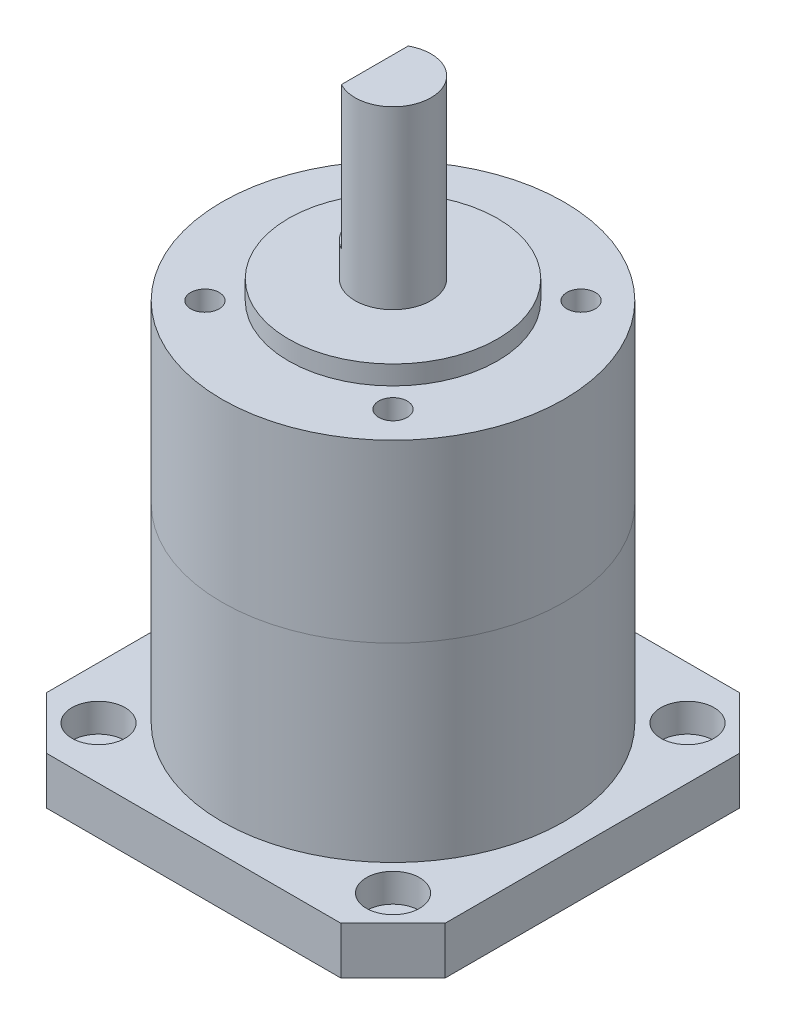
ISO-10303-21;
HEADER;
FILE_DESCRIPTION(('STEP AP214'),'2;1');
FILE_NAME('part.step','',(''),(''),'','','');
FILE_SCHEMA(('AUTOMOTIVE_DESIGN { 1 0 10303 214 1 1 1 1 }'));
ENDSEC;
DATA;
#1=APPLICATION_CONTEXT('core data for automotive mechanical design processes');
#2=APPLICATION_PROTOCOL_DEFINITION('international standard','automotive_design',2000,#1);
#3=PRODUCT_CONTEXT('',#1,'mechanical');
#4=PRODUCT('Part','Part','',(#3));
#5=PRODUCT_RELATED_PRODUCT_CATEGORY('part','',(#4));
#6=PRODUCT_DEFINITION_FORMATION('','',#4);
#7=PRODUCT_DEFINITION_CONTEXT('part definition',#1,'design');
#8=PRODUCT_DEFINITION('design','',#6,#7);
#9=PRODUCT_DEFINITION_SHAPE('','',#8);
#10=(LENGTH_UNIT() NAMED_UNIT(*) SI_UNIT(.MILLI.,.METRE.));
#11=(NAMED_UNIT(*) PLANE_ANGLE_UNIT() SI_UNIT($,.RADIAN.));
#12=(NAMED_UNIT(*) SI_UNIT($,.STERADIAN.) SOLID_ANGLE_UNIT());
#13=UNCERTAINTY_MEASURE_WITH_UNIT(LENGTH_MEASURE(1.E-05),#10,'distance_accuracy_value','');
#14=(GEOMETRIC_REPRESENTATION_CONTEXT(3) GLOBAL_UNCERTAINTY_ASSIGNED_CONTEXT((#13)) GLOBAL_UNIT_ASSIGNED_CONTEXT((#10,
#11,#12)) REPRESENTATION_CONTEXT('',''));
#15=CARTESIAN_POINT('',(0.,0.,0.));
#16=DIRECTION('',(0.,0.,1.));
#17=DIRECTION('',(1.,0.,0.));
#18=AXIS2_PLACEMENT_3D('',#15,#16,#17);
#19=CARTESIAN_POINT('',(-15.5000000000001,9.24264068712275,15.5));
#20=DIRECTION('',(0.,-1.,0.));
#21=DIRECTION('',(0.,0.,-1.));
#22=AXIS2_PLACEMENT_3D('',#19,#20,#21);
#23=CYLINDRICAL_SURFACE('',#22,1.5);
#24=CARTESIAN_POINT('',(-15.5000000000001,0.,15.5));
#25=DIRECTION('',(0.,-1.,0.));
#26=DIRECTION('',(0.,0.,-1.));
#27=AXIS2_PLACEMENT_3D('',#24,#25,#26);
#28=CIRCLE('',#27,1.5);
#29=CARTESIAN_POINT('',(-15.5000000000001,0.,14.));
#30=VERTEX_POINT('',#29);
#31=EDGE_CURVE('E227',#30,#30,#28,.T.);
#32=ORIENTED_EDGE('',*,*,#31,.T.);
#33=EDGE_LOOP('',(#32));
#34=FACE_BOUND('',#33,.T.);
#35=CARTESIAN_POINT('',(-15.5000000000001,2.,15.5));
#36=DIRECTION('',(0.,1.,0.));
#37=DIRECTION('',(0.,0.,1.));
#38=AXIS2_PLACEMENT_3D('',#35,#36,#37);
#39=CIRCLE('',#38,1.5);
#40=CARTESIAN_POINT('',(-15.5000000000001,2.,17.));
#41=VERTEX_POINT('',#40);
#42=EDGE_CURVE('E49',#41,#41,#39,.F.);
#43=ORIENTED_EDGE('',*,*,#42,.F.);
#44=EDGE_LOOP('',(#43));
#45=FACE_BOUND('',#44,.T.);
#46=ADVANCED_FACE('F44',(#34,#45),#23,.F.);
#47=CARTESIAN_POINT('',(15.5,9.24264068712275,15.5000000000009));
#48=DIRECTION('',(0.,-1.,0.));
#49=DIRECTION('',(0.,0.,-1.));
#50=AXIS2_PLACEMENT_3D('',#47,#48,#49);
#51=CYLINDRICAL_SURFACE('',#50,1.5000000000009);
#52=CARTESIAN_POINT('',(15.5,0.,15.5000000000009));
#53=DIRECTION('',(0.,-1.,0.));
#54=DIRECTION('',(0.,0.,-1.));
#55=AXIS2_PLACEMENT_3D('',#52,#53,#54);
#56=CIRCLE('',#55,1.5000000000009);
#57=CARTESIAN_POINT('',(15.5,0.,14.));
#58=VERTEX_POINT('',#57);
#59=EDGE_CURVE('E223',#58,#58,#56,.T.);
#60=ORIENTED_EDGE('',*,*,#59,.T.);
#61=EDGE_LOOP('',(#60));
#62=FACE_BOUND('',#61,.T.);
#63=CARTESIAN_POINT('',(15.5,2.,15.5000000000009));
#64=DIRECTION('',(0.,1.,0.));
#65=DIRECTION('',(0.,0.,1.));
#66=AXIS2_PLACEMENT_3D('',#63,#64,#65);
#67=CIRCLE('',#66,1.5000000000009);
#68=CARTESIAN_POINT('',(15.5,2.,17.0000000000018));
#69=VERTEX_POINT('',#68);
#70=EDGE_CURVE('E326',#69,#69,#67,.F.);
#71=ORIENTED_EDGE('',*,*,#70,.F.);
#72=EDGE_LOOP('',(#71));
#73=FACE_BOUND('',#72,.T.);
#74=ADVANCED_FACE('F338',(#62,#73),#51,.F.);
#75=CARTESIAN_POINT('',(15.5000000000009,9.24264068712275,-15.4999999999991));
#76=DIRECTION('',(0.,-1.,0.));
#77=DIRECTION('',(0.,0.,-1.));
#78=AXIS2_PLACEMENT_3D('',#75,#76,#77);
#79=CYLINDRICAL_SURFACE('',#78,1.50000000000123);
#80=CARTESIAN_POINT('',(15.5000000000009,0.,-15.4999999999991));
#81=DIRECTION('',(0.,-1.,0.));
#82=DIRECTION('',(0.,0.,-1.));
#83=AXIS2_PLACEMENT_3D('',#80,#81,#82);
#84=CIRCLE('',#83,1.50000000000123);
#85=CARTESIAN_POINT('',(15.5000000000009,0.,-17.0000000000004));
#86=VERTEX_POINT('',#85);
#87=EDGE_CURVE('E228',#86,#86,#84,.T.);
#88=ORIENTED_EDGE('',*,*,#87,.T.);
#89=EDGE_LOOP('',(#88));
#90=FACE_BOUND('',#89,.T.);
#91=CARTESIAN_POINT('',(15.5000000000009,2.,-15.4999999999991));
#92=DIRECTION('',(0.,1.,0.));
#93=DIRECTION('',(0.,0.,1.));
#94=AXIS2_PLACEMENT_3D('',#91,#92,#93);
#95=CIRCLE('',#94,1.50000000000123);
#96=CARTESIAN_POINT('',(15.5000000000009,2.,-13.9999999999979));
#97=VERTEX_POINT('',#96);
#98=EDGE_CURVE('E322',#97,#97,#95,.F.);
#99=ORIENTED_EDGE('',*,*,#98,.F.);
#100=EDGE_LOOP('',(#99));
#101=FACE_BOUND('',#100,.T.);
#102=ADVANCED_FACE('F344',(#90,#101),#79,.F.);
#103=CARTESIAN_POINT('',(-15.4999999999991,9.24264068712275,-15.5000000000001));
#104=DIRECTION('',(0.,-1.,0.));
#105=DIRECTION('',(0.,0.,-1.));
#106=AXIS2_PLACEMENT_3D('',#103,#104,#105);
#107=CYLINDRICAL_SURFACE('',#106,1.50000000000047);
#108=CARTESIAN_POINT('',(-15.4999999999991,0.,-15.5000000000001));
#109=DIRECTION('',(0.,-1.,0.));
#110=DIRECTION('',(0.,0.,-1.));
#111=AXIS2_PLACEMENT_3D('',#108,#109,#110);
#112=CIRCLE('',#111,1.50000000000047);
#113=CARTESIAN_POINT('',(-15.4999999999991,0.,-17.0000000000005));
#114=VERTEX_POINT('',#113);
#115=EDGE_CURVE('E219',#114,#114,#112,.T.);
#116=ORIENTED_EDGE('',*,*,#115,.T.);
#117=EDGE_LOOP('',(#116));
#118=FACE_BOUND('',#117,.T.);
#119=CARTESIAN_POINT('',(-15.4999999999991,2.,-15.5000000000001));
#120=DIRECTION('',(0.,1.,0.));
#121=DIRECTION('',(0.,0.,1.));
#122=AXIS2_PLACEMENT_3D('',#119,#120,#121);
#123=CIRCLE('',#122,1.50000000000047);
#124=CARTESIAN_POINT('',(-15.4999999999991,2.,-13.9999999999996));
#125=VERTEX_POINT('',#124);
#126=EDGE_CURVE('E318',#125,#125,#123,.F.);
#127=ORIENTED_EDGE('',*,*,#126,.F.);
#128=EDGE_LOOP('',(#127));
#129=FACE_BOUND('',#128,.T.);
#130=ADVANCED_FACE('F349',(#118,#129),#107,.F.);
#131=CARTESIAN_POINT('',(0.,64.,0.));
#132=DIRECTION('',(0.,-1.,0.));
#133=DIRECTION('',(0.,0.,-1.));
#134=AXIS2_PLACEMENT_3D('',#131,#132,#133);
#135=CYLINDRICAL_SURFACE('',#134,4.);
#136=CARTESIAN_POINT('',(0.,45.5,0.));
#137=DIRECTION('',(0.,1.,0.));
#138=DIRECTION('',(0.,0.,1.));
#139=AXIS2_PLACEMENT_3D('',#136,#137,#138);
#140=CIRCLE('',#139,4.);
#141=CARTESIAN_POINT('',(0.,45.5,4.));
#142=VERTEX_POINT('',#141);
#143=EDGE_CURVE('E55',#142,#142,#140,.T.);
#144=ORIENTED_EDGE('',*,*,#143,.T.);
#145=EDGE_LOOP('',(#144));
#146=FACE_BOUND('',#145,.T.);
#147=DIRECTION('',(0.,1.,0.));
#148=VECTOR('',#147,1.);
#149=CARTESIAN_POINT('',(-1.91418574428097,49.,-3.51224898553498));
#150=LINE('',#149,#148);
#151=CARTESIAN_POINT('',(-1.91418574428097,49.,-3.51224898553498));
#152=VERTEX_POINT('',#151);
#153=CARTESIAN_POINT('',(-1.91418574428097,64.,-3.51224898553498));
#154=VERTEX_POINT('',#153);
#155=EDGE_CURVE('E125',#152,#154,#150,.T.);
#156=ORIENTED_EDGE('',*,*,#155,.T.);
#157=CARTESIAN_POINT('',(0.,64.,0.));
#158=DIRECTION('',(0.,1.,0.));
#159=DIRECTION('',(0.,0.,1.));
#160=AXIS2_PLACEMENT_3D('',#157,#158,#159);
#161=CIRCLE('',#160,4.);
#162=CARTESIAN_POINT('',(-1.91418574428097,64.,3.51224898553498));
#163=VERTEX_POINT('',#162);
#164=EDGE_CURVE('E164',#163,#154,#161,.T.);
#165=ORIENTED_EDGE('',*,*,#164,.F.);
#166=DIRECTION('',(0.,1.,0.));
#167=VECTOR('',#166,1.);
#168=CARTESIAN_POINT('',(-1.91418574428097,49.,3.51224898553498));
#169=LINE('',#168,#167);
#170=CARTESIAN_POINT('',(-1.91418574428097,49.,3.51224898553498));
#171=VERTEX_POINT('',#170);
#172=EDGE_CURVE('E63',#171,#163,#169,.T.);
#173=ORIENTED_EDGE('',*,*,#172,.F.);
#174=CARTESIAN_POINT('',(0.,49.,0.));
#175=DIRECTION('',(0.,1.,0.));
#176=DIRECTION('',(0.,0.,1.));
#177=AXIS2_PLACEMENT_3D('',#174,#175,#176);
#178=CIRCLE('',#177,4.);
#179=EDGE_CURVE('E136',#152,#171,#178,.T.);
#180=ORIENTED_EDGE('',*,*,#179,.F.);
#181=EDGE_LOOP('',(#156,#165,#173,#180));
#182=FACE_BOUND('',#181,.T.);
#183=ADVANCED_FACE('F142',(#146,#182),#135,.T.);
#184=CARTESIAN_POINT('',(0.,64.,0.));
#185=DIRECTION('',(0.,1.,0.));
#186=DIRECTION('',(0.,0.,1.));
#187=AXIS2_PLACEMENT_3D('',#184,#185,#186);
#188=PLANE('',#187);
#189=ORIENTED_EDGE('',*,*,#164,.T.);
#190=DIRECTION('',(0.,0.,1.));
#191=VECTOR('',#190,1.);
#192=CARTESIAN_POINT('',(-1.91418574428097,64.,0.));
#193=LINE('',#192,#191);
#194=EDGE_CURVE('E130',#154,#163,#193,.T.);
#195=ORIENTED_EDGE('',*,*,#194,.T.);
#196=EDGE_LOOP('',(#189,#195));
#197=FACE_BOUND('',#196,.T.);
#198=ADVANCED_FACE('F434',(#197),#188,.T.);
#199=CARTESIAN_POINT('',(0.,43.5,0.));
#200=DIRECTION('',(0.,-1.,0.));
#201=DIRECTION('',(0.,0.,-1.));
#202=AXIS2_PLACEMENT_3D('',#199,#200,#201);
#203=CYLINDRICAL_SURFACE('',#202,18.);
#204=CARTESIAN_POINT('',(0.,43.5,0.));
#205=DIRECTION('',(0.,1.,0.));
#206=DIRECTION('',(0.,0.,1.));
#207=AXIS2_PLACEMENT_3D('',#204,#205,#206);
#208=CIRCLE('',#207,18.);
#209=CARTESIAN_POINT('',(0.,43.5,18.));
#210=VERTEX_POINT('',#209);
#211=EDGE_CURVE('E215',#210,#210,#208,.T.);
#212=ORIENTED_EDGE('',*,*,#211,.F.);
#213=EDGE_LOOP('',(#212));
#214=FACE_BOUND('',#213,.T.);
#215=CARTESIAN_POINT('',(0.,25.,0.));
#216=DIRECTION('',(0.,1.,0.));
#217=DIRECTION('',(0.,0.,1.));
#218=AXIS2_PLACEMENT_3D('',#215,#216,#217);
#219=CIRCLE('',#218,18.);
#220=CARTESIAN_POINT('',(0.,25.,18.));
#221=VERTEX_POINT('',#220);
#222=EDGE_CURVE('E12',#221,#221,#219,.T.);
#223=ORIENTED_EDGE('',*,*,#222,.T.);
#224=EDGE_LOOP('',(#223));
#225=FACE_BOUND('',#224,.T.);
#226=ADVANCED_FACE('F374',(#214,#225),#203,.T.);
#227=CARTESIAN_POINT('',(21.,5.,-21.));
#228=DIRECTION('',(-1.,0.,0.));
#229=DIRECTION('',(0.,0.,1.));
#230=AXIS2_PLACEMENT_3D('',#227,#228,#229);
#231=PLANE('',#230);
#232=DIRECTION('',(0.,0.,-1.));
#233=VECTOR('',#232,1.);
#234=CARTESIAN_POINT('',(21.,5.,-21.));
#235=LINE('',#234,#233);
#236=CARTESIAN_POINT('',(21.,5.,15.5));
#237=VERTEX_POINT('',#236);
#238=CARTESIAN_POINT('',(21.,5.,-15.5));
#239=VERTEX_POINT('',#238);
#240=EDGE_CURVE('E239',#237,#239,#235,.T.);
#241=ORIENTED_EDGE('',*,*,#240,.F.);
#242=DIRECTION('',(0.,-1.,0.));
#243=VECTOR('',#242,1.);
#244=CARTESIAN_POINT('',(21.,5.,15.5));
#245=LINE('',#244,#243);
#246=CARTESIAN_POINT('',(21.,0.,15.5));
#247=VERTEX_POINT('',#246);
#248=EDGE_CURVE('E309',#237,#247,#245,.T.);
#249=ORIENTED_EDGE('',*,*,#248,.T.);
#250=DIRECTION('',(0.,0.,-1.));
#251=VECTOR('',#250,1.);
#252=CARTESIAN_POINT('',(21.,0.,-21.));
#253=LINE('',#252,#251);
#254=CARTESIAN_POINT('',(21.,0.,-15.5));
#255=VERTEX_POINT('',#254);
#256=EDGE_CURVE('E238',#247,#255,#253,.T.);
#257=ORIENTED_EDGE('',*,*,#256,.T.);
#258=DIRECTION('',(0.,1.,0.));
#259=VECTOR('',#258,1.);
#260=CARTESIAN_POINT('',(21.,5.,-15.5));
#261=LINE('',#260,#259);
#262=EDGE_CURVE('E306',#255,#239,#261,.T.);
#263=ORIENTED_EDGE('',*,*,#262,.T.);
#264=EDGE_LOOP('',(#241,#249,#257,#263));
#265=FACE_BOUND('',#264,.T.);
#266=ADVANCED_FACE('F371',(#265),#231,.F.);
#267=CARTESIAN_POINT('',(-21.,5.,-21.));
#268=DIRECTION('',(0.,0.,1.));
#269=DIRECTION('',(1.,0.,0.));
#270=AXIS2_PLACEMENT_3D('',#267,#268,#269);
#271=PLANE('',#270);
#272=DIRECTION('',(-1.,0.,0.));
#273=VECTOR('',#272,1.);
#274=CARTESIAN_POINT('',(-21.,5.,-21.));
#275=LINE('',#274,#273);
#276=CARTESIAN_POINT('',(15.5,5.,-21.));
#277=VERTEX_POINT('',#276);
#278=CARTESIAN_POINT('',(-15.5,5.,-21.));
#279=VERTEX_POINT('',#278);
#280=EDGE_CURVE('E243',#277,#279,#275,.T.);
#281=ORIENTED_EDGE('',*,*,#280,.F.);
#282=DIRECTION('',(0.,-1.,0.));
#283=VECTOR('',#282,1.);
#284=CARTESIAN_POINT('',(15.5,5.,-21.));
#285=LINE('',#284,#283);
#286=CARTESIAN_POINT('',(15.5,0.,-21.));
#287=VERTEX_POINT('',#286);
#288=EDGE_CURVE('E174',#277,#287,#285,.T.);
#289=ORIENTED_EDGE('',*,*,#288,.T.);
#290=DIRECTION('',(-1.,0.,0.));
#291=VECTOR('',#290,1.);
#292=CARTESIAN_POINT('',(-21.,0.,-21.));
#293=LINE('',#292,#291);
#294=CARTESIAN_POINT('',(-15.5,0.,-21.));
#295=VERTEX_POINT('',#294);
#296=EDGE_CURVE('E259',#287,#295,#293,.T.);
#297=ORIENTED_EDGE('',*,*,#296,.T.);
#298=DIRECTION('',(0.,1.,0.));
#299=VECTOR('',#298,1.);
#300=CARTESIAN_POINT('',(-15.5,5.,-21.));
#301=LINE('',#300,#299);
#302=EDGE_CURVE('E71',#295,#279,#301,.T.);
#303=ORIENTED_EDGE('',*,*,#302,.T.);
#304=EDGE_LOOP('',(#281,#289,#297,#303));
#305=FACE_BOUND('',#304,.T.);
#306=ADVANCED_FACE('F367',(#305),#271,.F.);
#307=CARTESIAN_POINT('',(-21.,5.,-21.));
#308=DIRECTION('',(1.,0.,0.));
#309=DIRECTION('',(0.,0.,-1.));
#310=AXIS2_PLACEMENT_3D('',#307,#308,#309);
#311=PLANE('',#310);
#312=DIRECTION('',(0.,0.,1.));
#313=VECTOR('',#312,1.);
#314=CARTESIAN_POINT('',(-21.,0.,-21.));
#315=LINE('',#314,#313);
#316=CARTESIAN_POINT('',(-21.,0.,-15.5));
#317=VERTEX_POINT('',#316);
#318=CARTESIAN_POINT('',(-21.,0.,15.5));
#319=VERTEX_POINT('',#318);
#320=EDGE_CURVE('E262',#317,#319,#315,.T.);
#321=ORIENTED_EDGE('',*,*,#320,.T.);
#322=DIRECTION('',(0.,1.,0.));
#323=VECTOR('',#322,1.);
#324=CARTESIAN_POINT('',(-21.,5.,15.5));
#325=LINE('',#324,#323);
#326=CARTESIAN_POINT('',(-21.,5.,15.5));
#327=VERTEX_POINT('',#326);
#328=EDGE_CURVE('E291',#319,#327,#325,.T.);
#329=ORIENTED_EDGE('',*,*,#328,.T.);
#330=DIRECTION('',(0.,0.,1.));
#331=VECTOR('',#330,1.);
#332=CARTESIAN_POINT('',(-21.,5.,-21.));
#333=LINE('',#332,#331);
#334=CARTESIAN_POINT('',(-21.,5.,-15.5));
#335=VERTEX_POINT('',#334);
#336=EDGE_CURVE('E247',#335,#327,#333,.T.);
#337=ORIENTED_EDGE('',*,*,#336,.F.);
#338=DIRECTION('',(0.,-1.,0.));
#339=VECTOR('',#338,1.);
#340=CARTESIAN_POINT('',(-21.,5.,-15.5));
#341=LINE('',#340,#339);
#342=EDGE_CURVE('E287',#335,#317,#341,.T.);
#343=ORIENTED_EDGE('',*,*,#342,.T.);
#344=EDGE_LOOP('',(#321,#329,#337,#343));
#345=FACE_BOUND('',#344,.T.);
#346=ADVANCED_FACE('F363',(#345),#311,.F.);
#347=CARTESIAN_POINT('',(-21.,5.,21.));
#348=DIRECTION('',(0.,0.,-1.));
#349=DIRECTION('',(-1.,0.,0.));
#350=AXIS2_PLACEMENT_3D('',#347,#348,#349);
#351=PLANE('',#350);
#352=DIRECTION('',(1.,0.,0.));
#353=VECTOR('',#352,1.);
#354=CARTESIAN_POINT('',(-21.,5.,21.));
#355=LINE('',#354,#353);
#356=CARTESIAN_POINT('',(-15.5,5.,21.));
#357=VERTEX_POINT('',#356);
#358=CARTESIAN_POINT('',(15.5,5.,21.));
#359=VERTEX_POINT('',#358);
#360=EDGE_CURVE('E251',#357,#359,#355,.T.);
#361=ORIENTED_EDGE('',*,*,#360,.F.);
#362=DIRECTION('',(0.,-1.,0.));
#363=VECTOR('',#362,1.);
#364=CARTESIAN_POINT('',(-15.5,5.,21.));
#365=LINE('',#364,#363);
#366=CARTESIAN_POINT('',(-15.5,0.,21.));
#367=VERTEX_POINT('',#366);
#368=EDGE_CURVE('E271',#357,#367,#365,.T.);
#369=ORIENTED_EDGE('',*,*,#368,.T.);
#370=DIRECTION('',(1.,0.,0.));
#371=VECTOR('',#370,1.);
#372=CARTESIAN_POINT('',(-21.,0.,21.));
#373=LINE('',#372,#371);
#374=CARTESIAN_POINT('',(15.5,0.,21.));
#375=VERTEX_POINT('',#374);
#376=EDGE_CURVE('E244',#367,#375,#373,.T.);
#377=ORIENTED_EDGE('',*,*,#376,.T.);
#378=DIRECTION('',(0.,1.,0.));
#379=VECTOR('',#378,1.);
#380=CARTESIAN_POINT('',(15.5,5.,21.));
#381=LINE('',#380,#379);
#382=EDGE_CURVE('E255',#375,#359,#381,.T.);
#383=ORIENTED_EDGE('',*,*,#382,.T.);
#384=EDGE_LOOP('',(#361,#369,#377,#383));
#385=FACE_BOUND('',#384,.T.);
#386=ADVANCED_FACE('F355',(#385),#351,.F.);
#387=CARTESIAN_POINT('',(0.,5.,0.));
#388=DIRECTION('',(0.,1.,0.));
#389=DIRECTION('',(0.,0.,1.));
#390=AXIS2_PLACEMENT_3D('',#387,#388,#389);
#391=PLANE('',#390);
#392=CARTESIAN_POINT('',(15.5000000000009,5.,-15.4999999999991));
#393=DIRECTION('',(0.,1.,0.));
#394=DIRECTION('',(0.,0.,1.));
#395=AXIS2_PLACEMENT_3D('',#392,#393,#394);
#396=CIRCLE('',#395,2.8);
#397=CARTESIAN_POINT('',(15.5000000000009,5.,-12.6999999999991));
#398=VERTEX_POINT('',#397);
#399=EDGE_CURVE('E836',#398,#398,#396,.T.);
#400=ORIENTED_EDGE('',*,*,#399,.F.);
#401=EDGE_LOOP('',(#400));
#402=FACE_BOUND('',#401,.T.);
#403=CARTESIAN_POINT('',(-15.5000000000001,5.,15.5));
#404=DIRECTION('',(0.,1.,0.));
#405=DIRECTION('',(0.,0.,1.));
#406=AXIS2_PLACEMENT_3D('',#403,#404,#405);
#407=CIRCLE('',#406,2.8);
#408=CARTESIAN_POINT('',(-15.5000000000001,5.,18.3));
#409=VERTEX_POINT('',#408);
#410=EDGE_CURVE('E829',#409,#409,#407,.T.);
#411=ORIENTED_EDGE('',*,*,#410,.F.);
#412=EDGE_LOOP('',(#411));
#413=FACE_BOUND('',#412,.T.);
#414=CARTESIAN_POINT('',(15.5,5.,15.5000000000009));
#415=DIRECTION('',(0.,1.,0.));
#416=DIRECTION('',(0.,0.,1.));
#417=AXIS2_PLACEMENT_3D('',#414,#415,#416);
#418=CIRCLE('',#417,2.8);
#419=CARTESIAN_POINT('',(15.5,5.,18.3000000000009));
#420=VERTEX_POINT('',#419);
#421=EDGE_CURVE('E839',#420,#420,#418,.T.);
#422=ORIENTED_EDGE('',*,*,#421,.F.);
#423=EDGE_LOOP('',(#422));
#424=FACE_BOUND('',#423,.T.);
#425=CARTESIAN_POINT('',(-15.4999999999991,5.,-15.5000000000001));
#426=DIRECTION('',(0.,1.,0.));
#427=DIRECTION('',(0.,0.,1.));
#428=AXIS2_PLACEMENT_3D('',#425,#426,#427);
#429=CIRCLE('',#428,2.8);
#430=CARTESIAN_POINT('',(-15.4999999999991,5.,-12.7000000000001));
#431=VERTEX_POINT('',#430);
#432=EDGE_CURVE('E845',#431,#431,#429,.T.);
#433=ORIENTED_EDGE('',*,*,#432,.F.);
#434=EDGE_LOOP('',(#433));
#435=FACE_BOUND('',#434,.T.);
#436=CARTESIAN_POINT('',(0.,5.,0.));
#437=DIRECTION('',(0.,1.,0.));
#438=DIRECTION('',(0.,0.,1.));
#439=AXIS2_PLACEMENT_3D('',#436,#437,#438);
#440=CIRCLE('',#439,18.);
#441=CARTESIAN_POINT('',(0.,5.,18.));
#442=VERTEX_POINT('',#441);
#443=EDGE_CURVE('E211',#442,#442,#440,.T.);
#444=ORIENTED_EDGE('',*,*,#443,.F.);
#445=EDGE_LOOP('',(#444));
#446=FACE_BOUND('',#445,.T.);
#447=ORIENTED_EDGE('',*,*,#336,.T.);
#448=DIRECTION('',(-0.707106781186547,0.,-0.707106781186548));
#449=VECTOR('',#448,1.);
#450=CARTESIAN_POINT('',(-18.25,5.,18.25));
#451=LINE('',#450,#449);
#452=EDGE_CURVE('E303',#327,#357,#451,.F.);
#453=ORIENTED_EDGE('',*,*,#452,.T.);
#454=ORIENTED_EDGE('',*,*,#360,.T.);
#455=DIRECTION('',(-0.707106781186548,0.,0.707106781186547));
#456=VECTOR('',#455,1.);
#457=CARTESIAN_POINT('',(18.25,5.,18.25));
#458=LINE('',#457,#456);
#459=EDGE_CURVE('E300',#359,#237,#458,.F.);
#460=ORIENTED_EDGE('',*,*,#459,.T.);
#461=ORIENTED_EDGE('',*,*,#240,.T.);
#462=DIRECTION('',(0.707106781186548,0.,0.707106781186547));
#463=VECTOR('',#462,1.);
#464=CARTESIAN_POINT('',(18.25,5.,-18.25));
#465=LINE('',#464,#463);
#466=EDGE_CURVE('E297',#239,#277,#465,.F.);
#467=ORIENTED_EDGE('',*,*,#466,.T.);
#468=ORIENTED_EDGE('',*,*,#280,.T.);
#469=DIRECTION('',(0.707106781186548,0.,-0.707106781186548));
#470=VECTOR('',#469,1.);
#471=CARTESIAN_POINT('',(-18.25,5.,-18.25));
#472=LINE('',#471,#470);
#473=EDGE_CURVE('E294',#279,#335,#472,.F.);
#474=ORIENTED_EDGE('',*,*,#473,.T.);
#475=EDGE_LOOP('',(#447,#453,#454,#460,#461,#467,#468,#474));
#476=FACE_BOUND('',#475,.T.);
#477=ADVANCED_FACE('F351',(#402,#413,#424,#435,#446,#476),#391,.T.);
#478=CARTESIAN_POINT('',(0.,0.,0.));
#479=DIRECTION('',(0.,1.,0.));
#480=DIRECTION('',(0.,0.,1.));
#481=AXIS2_PLACEMENT_3D('',#478,#479,#480);
#482=PLANE('',#481);
#483=CARTESIAN_POINT('',(0.,0.,0.));
#484=DIRECTION('',(0.,-1.,0.));
#485=DIRECTION('',(0.,0.,-1.));
#486=AXIS2_PLACEMENT_3D('',#483,#484,#485);
#487=CIRCLE('',#486,11.);
#488=CARTESIAN_POINT('',(0.,0.,-11.));
#489=VERTEX_POINT('',#488);
#490=EDGE_CURVE('E156',#489,#489,#487,.T.);
#491=ORIENTED_EDGE('',*,*,#490,.F.);
#492=EDGE_LOOP('',(#491));
#493=FACE_BOUND('',#492,.T.);
#494=ORIENTED_EDGE('',*,*,#115,.F.);
#495=EDGE_LOOP('',(#494));
#496=FACE_BOUND('',#495,.T.);
#497=ORIENTED_EDGE('',*,*,#87,.F.);
#498=EDGE_LOOP('',(#497));
#499=FACE_BOUND('',#498,.T.);
#500=ORIENTED_EDGE('',*,*,#59,.F.);
#501=EDGE_LOOP('',(#500));
#502=FACE_BOUND('',#501,.T.);
#503=ORIENTED_EDGE('',*,*,#31,.F.);
#504=EDGE_LOOP('',(#503));
#505=FACE_BOUND('',#504,.T.);
#506=ORIENTED_EDGE('',*,*,#376,.F.);
#507=DIRECTION('',(0.707106781186547,0.,0.707106781186548));
#508=VECTOR('',#507,1.);
#509=CARTESIAN_POINT('',(-15.5,0.,21.));
#510=LINE('',#509,#508);
#511=EDGE_CURVE('E284',#367,#319,#510,.F.);
#512=ORIENTED_EDGE('',*,*,#511,.T.);
#513=ORIENTED_EDGE('',*,*,#320,.F.);
#514=DIRECTION('',(-0.707106781186548,0.,0.707106781186548));
#515=VECTOR('',#514,1.);
#516=CARTESIAN_POINT('',(-21.,0.,-15.5));
#517=LINE('',#516,#515);
#518=EDGE_CURVE('E275',#317,#295,#517,.F.);
#519=ORIENTED_EDGE('',*,*,#518,.T.);
#520=ORIENTED_EDGE('',*,*,#296,.F.);
#521=DIRECTION('',(-0.707106781186548,0.,-0.707106781186547));
#522=VECTOR('',#521,1.);
#523=CARTESIAN_POINT('',(15.5,0.,-21.));
#524=LINE('',#523,#522);
#525=EDGE_CURVE('E278',#287,#255,#524,.F.);
#526=ORIENTED_EDGE('',*,*,#525,.T.);
#527=ORIENTED_EDGE('',*,*,#256,.F.);
#528=DIRECTION('',(0.707106781186548,0.,-0.707106781186547));
#529=VECTOR('',#528,1.);
#530=CARTESIAN_POINT('',(21.,0.,15.5));
#531=LINE('',#530,#529);
#532=EDGE_CURVE('E281',#247,#375,#531,.F.);
#533=ORIENTED_EDGE('',*,*,#532,.T.);
#534=EDGE_LOOP('',(#506,#512,#513,#519,#520,#526,#527,#533));
#535=FACE_BOUND('',#534,.T.);
#536=ADVANCED_FACE('F354',(#493,#496,#499,#502,#505,#535),#482,.F.);
#537=CARTESIAN_POINT('',(-15.5,5.,21.));
#538=DIRECTION('',(0.707106781186548,0.,-0.707106781186547));
#539=DIRECTION('',(0.,-1.,0.));
#540=AXIS2_PLACEMENT_3D('',#537,#538,#539);
#541=PLANE('',#540);
#542=ORIENTED_EDGE('',*,*,#452,.F.);
#543=ORIENTED_EDGE('',*,*,#328,.F.);
#544=ORIENTED_EDGE('',*,*,#511,.F.);
#545=ORIENTED_EDGE('',*,*,#368,.F.);
#546=EDGE_LOOP('',(#542,#543,#544,#545));
#547=FACE_BOUND('',#546,.T.);
#548=ADVANCED_FACE('F359',(#547),#541,.F.);
#549=CARTESIAN_POINT('',(21.,5.,15.5));
#550=DIRECTION('',(-0.707106781186547,0.,-0.707106781186548));
#551=DIRECTION('',(0.,-1.,0.));
#552=AXIS2_PLACEMENT_3D('',#549,#550,#551);
#553=PLANE('',#552);
#554=ORIENTED_EDGE('',*,*,#459,.F.);
#555=ORIENTED_EDGE('',*,*,#382,.F.);
#556=ORIENTED_EDGE('',*,*,#532,.F.);
#557=ORIENTED_EDGE('',*,*,#248,.F.);
#558=EDGE_LOOP('',(#554,#555,#556,#557));
#559=FACE_BOUND('',#558,.T.);
#560=ADVANCED_FACE('F382',(#559),#553,.F.);
#561=CARTESIAN_POINT('',(15.5,5.,-21.));
#562=DIRECTION('',(-0.707106781186547,0.,0.707106781186548));
#563=DIRECTION('',(0.,-1.,0.));
#564=AXIS2_PLACEMENT_3D('',#561,#562,#563);
#565=PLANE('',#564);
#566=ORIENTED_EDGE('',*,*,#466,.F.);
#567=ORIENTED_EDGE('',*,*,#262,.F.);
#568=ORIENTED_EDGE('',*,*,#525,.F.);
#569=ORIENTED_EDGE('',*,*,#288,.F.);
#570=EDGE_LOOP('',(#566,#567,#568,#569));
#571=FACE_BOUND('',#570,.T.);
#572=ADVANCED_FACE('F388',(#571),#565,.F.);
#573=CARTESIAN_POINT('',(-21.,5.,-15.5));
#574=DIRECTION('',(0.707106781186547,0.,0.707106781186547));
#575=DIRECTION('',(0.,-1.,0.));
#576=AXIS2_PLACEMENT_3D('',#573,#574,#575);
#577=PLANE('',#576);
#578=ORIENTED_EDGE('',*,*,#473,.F.);
#579=ORIENTED_EDGE('',*,*,#302,.F.);
#580=ORIENTED_EDGE('',*,*,#518,.F.);
#581=ORIENTED_EDGE('',*,*,#342,.F.);
#582=EDGE_LOOP('',(#578,#579,#580,#581));
#583=FACE_BOUND('',#582,.T.);
#584=ADVANCED_FACE('F47',(#583),#577,.F.);
#585=ORIENTED_EDGE('',*,*,#222,.F.);
#586=EDGE_LOOP('',(#585));
#587=FACE_BOUND('',#586,.T.);
#588=ORIENTED_EDGE('',*,*,#443,.T.);
#589=EDGE_LOOP('',(#588));
#590=FACE_BOUND('',#589,.T.);
#591=ADVANCED_FACE('F397',(#587,#590),#203,.T.);
#592=CARTESIAN_POINT('',(0.,43.5,0.));
#593=DIRECTION('',(0.,1.,0.));
#594=DIRECTION('',(0.,0.,1.));
#595=AXIS2_PLACEMENT_3D('',#592,#593,#594);
#596=PLANE('',#595);
#597=CARTESIAN_POINT('',(0.,43.5,0.));
#598=DIRECTION('',(0.,1.,0.));
#599=DIRECTION('',(0.,0.,1.));
#600=AXIS2_PLACEMENT_3D('',#597,#598,#599);
#601=CIRCLE('',#600,11.);
#602=CARTESIAN_POINT('',(0.,43.5,11.));
#603=VERTEX_POINT('',#602);
#604=EDGE_CURVE('E170',#603,#603,#601,.T.);
#605=ORIENTED_EDGE('',*,*,#604,.F.);
#606=EDGE_LOOP('',(#605));
#607=FACE_BOUND('',#606,.T.);
#608=CARTESIAN_POINT('',(-9.89949493661111,43.5,9.89949493661168));
#609=DIRECTION('',(0.,1.,0.));
#610=DIRECTION('',(0.,0.,1.));
#611=AXIS2_PLACEMENT_3D('',#608,#609,#610);
#612=CIRCLE('',#611,1.50000000000029);
#613=CARTESIAN_POINT('',(-9.89949493661111,43.5,11.399494936612));
#614=VERTEX_POINT('',#613);
#615=EDGE_CURVE('E200',#614,#614,#612,.T.);
#616=ORIENTED_EDGE('',*,*,#615,.F.);
#617=EDGE_LOOP('',(#616));
#618=FACE_BOUND('',#617,.T.);
#619=CARTESIAN_POINT('',(9.89949493661223,43.5,9.89949493661111));
#620=DIRECTION('',(0.,1.,0.));
#621=DIRECTION('',(0.,0.,1.));
#622=AXIS2_PLACEMENT_3D('',#619,#620,#621);
#623=CIRCLE('',#622,1.50000000000078);
#624=CARTESIAN_POINT('',(9.89949493661223,43.5,11.3994949366119));
#625=VERTEX_POINT('',#624);
#626=EDGE_CURVE('E192',#625,#625,#623,.T.);
#627=ORIENTED_EDGE('',*,*,#626,.F.);
#628=EDGE_LOOP('',(#627));
#629=FACE_BOUND('',#628,.T.);
#630=CARTESIAN_POINT('',(9.89949493661167,43.5,-9.89949493661222));
#631=DIRECTION('',(0.,1.,0.));
#632=DIRECTION('',(0.,0.,1.));
#633=AXIS2_PLACEMENT_3D('',#630,#631,#632);
#634=CIRCLE('',#633,1.50000000000057);
#635=CARTESIAN_POINT('',(9.89949493661167,43.5,-8.39949493661165));
#636=VERTEX_POINT('',#635);
#637=EDGE_CURVE('E183',#636,#636,#634,.T.);
#638=ORIENTED_EDGE('',*,*,#637,.F.);
#639=EDGE_LOOP('',(#638));
#640=FACE_BOUND('',#639,.T.);
#641=CARTESIAN_POINT('',(-9.89949493661167,43.5,-9.89949493661166));
#642=DIRECTION('',(0.,1.,0.));
#643=DIRECTION('',(0.,0.,1.));
#644=AXIS2_PLACEMENT_3D('',#641,#642,#643);
#645=CIRCLE('',#644,1.5);
#646=CARTESIAN_POINT('',(-9.89949493661167,43.5,-8.39949493661166));
#647=VERTEX_POINT('',#646);
#648=EDGE_CURVE('E187',#647,#647,#645,.T.);
#649=ORIENTED_EDGE('',*,*,#648,.F.);
#650=EDGE_LOOP('',(#649));
#651=FACE_BOUND('',#650,.T.);
#652=ORIENTED_EDGE('',*,*,#211,.T.);
#653=EDGE_LOOP('',(#652));
#654=FACE_BOUND('',#653,.T.);
#655=ADVANCED_FACE('F422',(#607,#618,#629,#640,#651,#654),#596,.T.);
#656=CARTESIAN_POINT('',(-9.89949493661167,39.5,-9.89949493661166));
#657=DIRECTION('',(0.,1.,0.));
#658=DIRECTION('',(0.,0.,1.));
#659=AXIS2_PLACEMENT_3D('',#656,#657,#658);
#660=CYLINDRICAL_SURFACE('',#659,1.5);
#661=CARTESIAN_POINT('',(-9.89949493661167,39.5,-9.89949493661166));
#662=DIRECTION('',(0.,1.,0.));
#663=DIRECTION('',(0.,0.,1.));
#664=AXIS2_PLACEMENT_3D('',#661,#662,#663);
#665=CIRCLE('',#664,1.5);
#666=CARTESIAN_POINT('',(-9.89949493661167,39.5,-8.39949493661166));
#667=VERTEX_POINT('',#666);
#668=EDGE_CURVE('E207',#667,#667,#665,.T.);
#669=ORIENTED_EDGE('',*,*,#668,.F.);
#670=EDGE_LOOP('',(#669));
#671=FACE_BOUND('',#670,.T.);
#672=ORIENTED_EDGE('',*,*,#648,.T.);
#673=EDGE_LOOP('',(#672));
#674=FACE_BOUND('',#673,.T.);
#675=ADVANCED_FACE('F428',(#671,#674),#660,.F.);
#676=CARTESIAN_POINT('',(-9.89949493661167,39.5,-9.89949493661166));
#677=DIRECTION('',(0.,1.,0.));
#678=DIRECTION('',(0.,0.,1.));
#679=AXIS2_PLACEMENT_3D('',#676,#677,#678);
#680=PLANE('',#679);
#681=ORIENTED_EDGE('',*,*,#668,.T.);
#682=EDGE_LOOP('',(#681));
#683=FACE_BOUND('',#682,.T.);
#684=ADVANCED_FACE('F466',(#683),#680,.T.);
#685=CARTESIAN_POINT('',(9.89949493661167,39.5,-9.89949493661222));
#686=DIRECTION('',(0.,1.,0.));
#687=DIRECTION('',(0.,0.,1.));
#688=AXIS2_PLACEMENT_3D('',#685,#686,#687);
#689=CYLINDRICAL_SURFACE('',#688,1.50000000000057);
#690=CARTESIAN_POINT('',(9.89949493661167,39.5,-9.89949493661222));
#691=DIRECTION('',(0.,1.,0.));
#692=DIRECTION('',(0.,0.,1.));
#693=AXIS2_PLACEMENT_3D('',#690,#691,#692);
#694=CIRCLE('',#693,1.50000000000057);
#695=CARTESIAN_POINT('',(9.89949493661167,39.5,-8.39949493661165));
#696=VERTEX_POINT('',#695);
#697=EDGE_CURVE('E188',#696,#696,#694,.T.);
#698=ORIENTED_EDGE('',*,*,#697,.F.);
#699=EDGE_LOOP('',(#698));
#700=FACE_BOUND('',#699,.T.);
#701=ORIENTED_EDGE('',*,*,#637,.T.);
#702=EDGE_LOOP('',(#701));
#703=FACE_BOUND('',#702,.T.);
#704=ADVANCED_FACE('F462',(#700,#703),#689,.F.);
#705=CARTESIAN_POINT('',(9.89949493661167,39.5,-9.89949493661222));
#706=DIRECTION('',(0.,1.,0.));
#707=DIRECTION('',(0.,0.,1.));
#708=AXIS2_PLACEMENT_3D('',#705,#706,#707);
#709=PLANE('',#708);
#710=ORIENTED_EDGE('',*,*,#697,.T.);
#711=EDGE_LOOP('',(#710));
#712=FACE_BOUND('',#711,.T.);
#713=ADVANCED_FACE('F465',(#712),#709,.T.);
#714=CARTESIAN_POINT('',(9.89949493661223,39.5,9.89949493661111));
#715=DIRECTION('',(0.,1.,0.));
#716=DIRECTION('',(0.,0.,1.));
#717=AXIS2_PLACEMENT_3D('',#714,#715,#716);
#718=CYLINDRICAL_SURFACE('',#717,1.50000000000078);
#719=CARTESIAN_POINT('',(9.89949493661223,39.5,9.89949493661111));
#720=DIRECTION('',(0.,1.,0.));
#721=DIRECTION('',(0.,0.,1.));
#722=AXIS2_PLACEMENT_3D('',#719,#720,#721);
#723=CIRCLE('',#722,1.50000000000078);
#724=CARTESIAN_POINT('',(9.89949493661223,39.5,11.3994949366119));
#725=VERTEX_POINT('',#724);
#726=EDGE_CURVE('E196',#725,#725,#723,.T.);
#727=ORIENTED_EDGE('',*,*,#726,.F.);
#728=EDGE_LOOP('',(#727));
#729=FACE_BOUND('',#728,.T.);
#730=ORIENTED_EDGE('',*,*,#626,.T.);
#731=EDGE_LOOP('',(#730));
#732=FACE_BOUND('',#731,.T.);
#733=ADVANCED_FACE('F470',(#729,#732),#718,.F.);
#734=CARTESIAN_POINT('',(9.89949493661223,39.5,9.89949493661111));
#735=DIRECTION('',(0.,1.,0.));
#736=DIRECTION('',(0.,0.,1.));
#737=AXIS2_PLACEMENT_3D('',#734,#735,#736);
#738=PLANE('',#737);
#739=ORIENTED_EDGE('',*,*,#726,.T.);
#740=EDGE_LOOP('',(#739));
#741=FACE_BOUND('',#740,.T.);
#742=ADVANCED_FACE('F474',(#741),#738,.T.);
#743=CARTESIAN_POINT('',(-9.89949493661111,39.5,9.89949493661168));
#744=DIRECTION('',(0.,1.,0.));
#745=DIRECTION('',(0.,0.,1.));
#746=AXIS2_PLACEMENT_3D('',#743,#744,#745);
#747=CYLINDRICAL_SURFACE('',#746,1.50000000000029);
#748=CARTESIAN_POINT('',(-9.89949493661111,39.5,9.89949493661168));
#749=DIRECTION('',(0.,1.,0.));
#750=DIRECTION('',(0.,0.,1.));
#751=AXIS2_PLACEMENT_3D('',#748,#749,#750);
#752=CIRCLE('',#751,1.50000000000029);
#753=CARTESIAN_POINT('',(-9.89949493661111,39.5,11.399494936612));
#754=VERTEX_POINT('',#753);
#755=EDGE_CURVE('E179',#754,#754,#752,.T.);
#756=ORIENTED_EDGE('',*,*,#755,.F.);
#757=EDGE_LOOP('',(#756));
#758=FACE_BOUND('',#757,.T.);
#759=ORIENTED_EDGE('',*,*,#615,.T.);
#760=EDGE_LOOP('',(#759));
#761=FACE_BOUND('',#760,.T.);
#762=ADVANCED_FACE('F478',(#758,#761),#747,.F.);
#763=CARTESIAN_POINT('',(-9.89949493661111,39.5,9.89949493661168));
#764=DIRECTION('',(0.,1.,0.));
#765=DIRECTION('',(0.,0.,1.));
#766=AXIS2_PLACEMENT_3D('',#763,#764,#765);
#767=PLANE('',#766);
#768=ORIENTED_EDGE('',*,*,#755,.T.);
#769=EDGE_LOOP('',(#768));
#770=FACE_BOUND('',#769,.T.);
#771=ADVANCED_FACE('F460',(#770),#767,.T.);
#772=CARTESIAN_POINT('',(0.,45.5,0.));
#773=DIRECTION('',(0.,-1.,0.));
#774=DIRECTION('',(0.,0.,-1.));
#775=AXIS2_PLACEMENT_3D('',#772,#773,#774);
#776=CYLINDRICAL_SURFACE('',#775,11.);
#777=CARTESIAN_POINT('',(0.,45.5,0.));
#778=DIRECTION('',(0.,1.,0.));
#779=DIRECTION('',(0.,0.,1.));
#780=AXIS2_PLACEMENT_3D('',#777,#778,#779);
#781=CIRCLE('',#780,11.);
#782=CARTESIAN_POINT('',(0.,45.5,11.));
#783=VERTEX_POINT('',#782);
#784=EDGE_CURVE('E175',#783,#783,#781,.T.);
#785=ORIENTED_EDGE('',*,*,#784,.F.);
#786=EDGE_LOOP('',(#785));
#787=FACE_BOUND('',#786,.T.);
#788=ORIENTED_EDGE('',*,*,#604,.T.);
#789=EDGE_LOOP('',(#788));
#790=FACE_BOUND('',#789,.T.);
#791=ADVANCED_FACE('F456',(#787,#790),#776,.T.);
#792=CARTESIAN_POINT('',(0.,45.5,0.));
#793=DIRECTION('',(0.,1.,0.));
#794=DIRECTION('',(0.,0.,1.));
#795=AXIS2_PLACEMENT_3D('',#792,#793,#794);
#796=PLANE('',#795);
#797=ORIENTED_EDGE('',*,*,#143,.F.);
#798=EDGE_LOOP('',(#797));
#799=FACE_BOUND('',#798,.T.);
#800=ORIENTED_EDGE('',*,*,#784,.T.);
#801=EDGE_LOOP('',(#800));
#802=FACE_BOUND('',#801,.T.);
#803=ADVANCED_FACE('F453',(#799,#802),#796,.T.);
#804=CARTESIAN_POINT('',(0.,3.,0.));
#805=DIRECTION('',(0.,-1.,0.));
#806=DIRECTION('',(0.,0.,-1.));
#807=AXIS2_PLACEMENT_3D('',#804,#805,#806);
#808=CYLINDRICAL_SURFACE('',#807,11.);
#809=CARTESIAN_POINT('',(0.,3.,0.));
#810=DIRECTION('',(0.,-1.,0.));
#811=DIRECTION('',(0.,0.,-1.));
#812=AXIS2_PLACEMENT_3D('',#809,#810,#811);
#813=CIRCLE('',#812,11.);
#814=CARTESIAN_POINT('',(0.,3.,-11.));
#815=VERTEX_POINT('',#814);
#816=EDGE_CURVE('E160',#815,#815,#813,.T.);
#817=ORIENTED_EDGE('',*,*,#816,.F.);
#818=EDGE_LOOP('',(#817));
#819=FACE_BOUND('',#818,.T.);
#820=ORIENTED_EDGE('',*,*,#490,.T.);
#821=EDGE_LOOP('',(#820));
#822=FACE_BOUND('',#821,.T.);
#823=ADVANCED_FACE('F450',(#819,#822),#808,.F.);
#824=CARTESIAN_POINT('',(0.,3.,0.));
#825=DIRECTION('',(0.,-1.,0.));
#826=DIRECTION('',(0.,0.,-1.));
#827=AXIS2_PLACEMENT_3D('',#824,#825,#826);
#828=PLANE('',#827);
#829=CARTESIAN_POINT('',(0.,3.,0.));
#830=DIRECTION('',(0.,-1.,0.));
#831=DIRECTION('',(0.,0.,-1.));
#832=AXIS2_PLACEMENT_3D('',#829,#830,#831);
#833=CIRCLE('',#832,8.);
#834=CARTESIAN_POINT('',(0.,3.,-8.));
#835=VERTEX_POINT('',#834);
#836=EDGE_CURVE('E150',#835,#835,#833,.T.);
#837=ORIENTED_EDGE('',*,*,#836,.F.);
#838=EDGE_LOOP('',(#837));
#839=FACE_BOUND('',#838,.T.);
#840=ORIENTED_EDGE('',*,*,#816,.T.);
#841=EDGE_LOOP('',(#840));
#842=FACE_BOUND('',#841,.T.);
#843=ADVANCED_FACE('F542',(#839,#842),#828,.T.);
#844=CARTESIAN_POINT('',(0.,13.,0.));
#845=DIRECTION('',(0.,-1.,0.));
#846=DIRECTION('',(0.,0.,-1.));
#847=AXIS2_PLACEMENT_3D('',#844,#845,#846);
#848=CYLINDRICAL_SURFACE('',#847,8.);
#849=CARTESIAN_POINT('',(0.,13.,0.));
#850=DIRECTION('',(0.,-1.,0.));
#851=DIRECTION('',(0.,0.,-1.));
#852=AXIS2_PLACEMENT_3D('',#849,#850,#851);
#853=CIRCLE('',#852,8.);
#854=CARTESIAN_POINT('',(0.,13.,-8.));
#855=VERTEX_POINT('',#854);
#856=EDGE_CURVE('E152',#855,#855,#853,.T.);
#857=ORIENTED_EDGE('',*,*,#856,.F.);
#858=EDGE_LOOP('',(#857));
#859=FACE_BOUND('',#858,.T.);
#860=ORIENTED_EDGE('',*,*,#836,.T.);
#861=EDGE_LOOP('',(#860));
#862=FACE_BOUND('',#861,.T.);
#863=ADVANCED_FACE('F549',(#859,#862),#848,.F.);
#864=CARTESIAN_POINT('',(0.,13.,0.));
#865=DIRECTION('',(0.,-1.,0.));
#866=DIRECTION('',(0.,0.,-1.));
#867=AXIS2_PLACEMENT_3D('',#864,#865,#866);
#868=PLANE('',#867);
#869=ORIENTED_EDGE('',*,*,#856,.T.);
#870=EDGE_LOOP('',(#869));
#871=FACE_BOUND('',#870,.T.);
#872=ADVANCED_FACE('F556',(#871),#868,.T.);
#873=CARTESIAN_POINT('',(-1.91418574428097,49.,0.));
#874=DIRECTION('',(-1.,0.,0.));
#875=DIRECTION('',(0.,0.,1.));
#876=AXIS2_PLACEMENT_3D('',#873,#874,#875);
#877=PLANE('',#876);
#878=ORIENTED_EDGE('',*,*,#194,.F.);
#879=ORIENTED_EDGE('',*,*,#155,.F.);
#880=DIRECTION('',(0.,0.,1.));
#881=VECTOR('',#880,1.);
#882=CARTESIAN_POINT('',(-1.91418574428097,49.,0.));
#883=LINE('',#882,#881);
#884=EDGE_CURVE('E128',#152,#171,#883,.T.);
#885=ORIENTED_EDGE('',*,*,#884,.T.);
#886=ORIENTED_EDGE('',*,*,#172,.T.);
#887=EDGE_LOOP('',(#878,#879,#885,#886));
#888=FACE_BOUND('',#887,.T.);
#889=ADVANCED_FACE('F127',(#888),#877,.T.);
#890=CARTESIAN_POINT('',(0.,49.,0.));
#891=DIRECTION('',(0.,1.,0.));
#892=DIRECTION('',(0.,0.,1.));
#893=AXIS2_PLACEMENT_3D('',#890,#891,#892);
#894=PLANE('',#893);
#895=ORIENTED_EDGE('',*,*,#884,.F.);
#896=ORIENTED_EDGE('',*,*,#179,.T.);
#897=EDGE_LOOP('',(#895,#896));
#898=FACE_BOUND('',#897,.T.);
#899=ADVANCED_FACE('F139',(#898),#894,.T.);
#900=CARTESIAN_POINT('',(-15.4999999999991,2.,-15.5000000000001));
#901=DIRECTION('',(0.,1.,0.));
#902=DIRECTION('',(0.,0.,1.));
#903=AXIS2_PLACEMENT_3D('',#900,#901,#902);
#904=PLANE('',#903);
#905=CARTESIAN_POINT('',(-15.4999999999991,2.,-15.5000000000001));
#906=DIRECTION('',(0.,1.,0.));
#907=DIRECTION('',(0.,0.,1.));
#908=AXIS2_PLACEMENT_3D('',#905,#906,#907);
#909=CIRCLE('',#908,2.8);
#910=CARTESIAN_POINT('',(-15.4999999999991,2.,-12.7000000000001));
#911=VERTEX_POINT('',#910);
#912=EDGE_CURVE('E323',#911,#911,#909,.T.);
#913=ORIENTED_EDGE('',*,*,#912,.T.);
#914=EDGE_LOOP('',(#913));
#915=FACE_BOUND('',#914,.T.);
#916=ORIENTED_EDGE('',*,*,#126,.T.);
#917=EDGE_LOOP('',(#916));
#918=FACE_BOUND('',#917,.T.);
#919=ADVANCED_FACE('F577',(#915,#918),#904,.T.);
#920=CARTESIAN_POINT('',(-15.4999999999991,2.,-15.5000000000001));
#921=DIRECTION('',(0.,1.,0.));
#922=DIRECTION('',(0.,0.,1.));
#923=AXIS2_PLACEMENT_3D('',#920,#921,#922);
#924=CYLINDRICAL_SURFACE('',#923,2.8);
#925=ORIENTED_EDGE('',*,*,#912,.F.);
#926=EDGE_LOOP('',(#925));
#927=FACE_BOUND('',#926,.T.);
#928=ORIENTED_EDGE('',*,*,#432,.T.);
#929=EDGE_LOOP('',(#928));
#930=FACE_BOUND('',#929,.T.);
#931=ADVANCED_FACE('F584',(#927,#930),#924,.F.);
#932=CARTESIAN_POINT('',(15.5000000000009,2.,-15.4999999999991));
#933=DIRECTION('',(0.,1.,0.));
#934=DIRECTION('',(0.,0.,1.));
#935=AXIS2_PLACEMENT_3D('',#932,#933,#934);
#936=PLANE('',#935);
#937=CARTESIAN_POINT('',(15.5000000000009,2.,-15.4999999999991));
#938=DIRECTION('',(0.,1.,0.));
#939=DIRECTION('',(0.,0.,1.));
#940=AXIS2_PLACEMENT_3D('',#937,#938,#939);
#941=CIRCLE('',#940,2.8);
#942=CARTESIAN_POINT('',(15.5000000000009,2.,-12.6999999999991));
#943=VERTEX_POINT('',#942);
#944=EDGE_CURVE('E848',#943,#943,#941,.T.);
#945=ORIENTED_EDGE('',*,*,#944,.T.);
#946=EDGE_LOOP('',(#945));
#947=FACE_BOUND('',#946,.T.);
#948=ORIENTED_EDGE('',*,*,#98,.T.);
#949=EDGE_LOOP('',(#948));
#950=FACE_BOUND('',#949,.T.);
#951=ADVANCED_FACE('F593',(#947,#950),#936,.T.);
#952=CARTESIAN_POINT('',(15.5000000000009,2.,-15.4999999999991));
#953=DIRECTION('',(0.,1.,0.));
#954=DIRECTION('',(0.,0.,1.));
#955=AXIS2_PLACEMENT_3D('',#952,#953,#954);
#956=CYLINDRICAL_SURFACE('',#955,2.8);
#957=ORIENTED_EDGE('',*,*,#944,.F.);
#958=EDGE_LOOP('',(#957));
#959=FACE_BOUND('',#958,.T.);
#960=ORIENTED_EDGE('',*,*,#399,.T.);
#961=EDGE_LOOP('',(#960));
#962=FACE_BOUND('',#961,.T.);
#963=ADVANCED_FACE('F601',(#959,#962),#956,.F.);
#964=CARTESIAN_POINT('',(15.5,2.,15.5000000000009));
#965=DIRECTION('',(0.,1.,0.));
#966=DIRECTION('',(0.,0.,1.));
#967=AXIS2_PLACEMENT_3D('',#964,#965,#966);
#968=PLANE('',#967);
#969=CARTESIAN_POINT('',(15.5,2.,15.5000000000009));
#970=DIRECTION('',(0.,1.,0.));
#971=DIRECTION('',(0.,0.,1.));
#972=AXIS2_PLACEMENT_3D('',#969,#970,#971);
#973=CIRCLE('',#972,2.8);
#974=CARTESIAN_POINT('',(15.5,2.,18.3000000000009));
#975=VERTEX_POINT('',#974);
#976=EDGE_CURVE('E832',#975,#975,#973,.T.);
#977=ORIENTED_EDGE('',*,*,#976,.T.);
#978=EDGE_LOOP('',(#977));
#979=FACE_BOUND('',#978,.T.);
#980=ORIENTED_EDGE('',*,*,#70,.T.);
#981=EDGE_LOOP('',(#980));
#982=FACE_BOUND('',#981,.T.);
#983=ADVANCED_FACE('F609',(#979,#982),#968,.T.);
#984=CARTESIAN_POINT('',(15.5,2.,15.5000000000009));
#985=DIRECTION('',(0.,1.,0.));
#986=DIRECTION('',(0.,0.,1.));
#987=AXIS2_PLACEMENT_3D('',#984,#985,#986);
#988=CYLINDRICAL_SURFACE('',#987,2.8);
#989=ORIENTED_EDGE('',*,*,#976,.F.);
#990=EDGE_LOOP('',(#989));
#991=FACE_BOUND('',#990,.T.);
#992=ORIENTED_EDGE('',*,*,#421,.T.);
#993=EDGE_LOOP('',(#992));
#994=FACE_BOUND('',#993,.T.);
#995=ADVANCED_FACE('F617',(#991,#994),#988,.F.);
#996=CARTESIAN_POINT('',(-15.5000000000001,2.,15.5));
#997=DIRECTION('',(0.,1.,0.));
#998=DIRECTION('',(0.,0.,1.));
#999=AXIS2_PLACEMENT_3D('',#996,#997,#998);
#1000=PLANE('',#999);
#1001=CARTESIAN_POINT('',(-15.5000000000001,2.,15.5));
#1002=DIRECTION('',(0.,1.,0.));
#1003=DIRECTION('',(0.,0.,1.));
#1004=AXIS2_PLACEMENT_3D('',#1001,#1002,#1003);
#1005=CIRCLE('',#1004,2.8);
#1006=CARTESIAN_POINT('',(-15.5000000000001,2.,18.3));
#1007=VERTEX_POINT('',#1006);
#1008=EDGE_CURVE('E826',#1007,#1007,#1005,.T.);
#1009=ORIENTED_EDGE('',*,*,#1008,.T.);
#1010=EDGE_LOOP('',(#1009));
#1011=FACE_BOUND('',#1010,.T.);
#1012=ORIENTED_EDGE('',*,*,#42,.T.);
#1013=EDGE_LOOP('',(#1012));
#1014=FACE_BOUND('',#1013,.T.);
#1015=ADVANCED_FACE('F335',(#1011,#1014),#1000,.T.);
#1016=CARTESIAN_POINT('',(-15.5000000000001,2.,15.5));
#1017=DIRECTION('',(0.,1.,0.));
#1018=DIRECTION('',(0.,0.,1.));
#1019=AXIS2_PLACEMENT_3D('',#1016,#1017,#1018);
#1020=CYLINDRICAL_SURFACE('',#1019,2.8);
#1021=ORIENTED_EDGE('',*,*,#1008,.F.);
#1022=EDGE_LOOP('',(#1021));
#1023=FACE_BOUND('',#1022,.T.);
#1024=ORIENTED_EDGE('',*,*,#410,.T.);
#1025=EDGE_LOOP('',(#1024));
#1026=FACE_BOUND('',#1025,.T.);
#1027=ADVANCED_FACE('F632',(#1023,#1026),#1020,.F.);
#1028=CLOSED_SHELL('',(#46,#74,#102,#130,#183,#198,#226,#266,#306,#346,#386,#477,#536,#548,#560,
#572,#584,#591,#655,#675,#684,#704,#713,#733,#742,#762,#771,#791,#803,#823,#843,#863,#872,#889,
#899,#919,#931,#951,#963,#983,#995,#1015,#1027));
#1029=MANIFOLD_SOLID_BREP('B2',#1028);
#1030=ADVANCED_BREP_SHAPE_REPRESENTATION('',(#18,#1029),#14);
#1031=SHAPE_DEFINITION_REPRESENTATION(#9,#1030);
ENDSEC;
END-ISO-10303-21;
